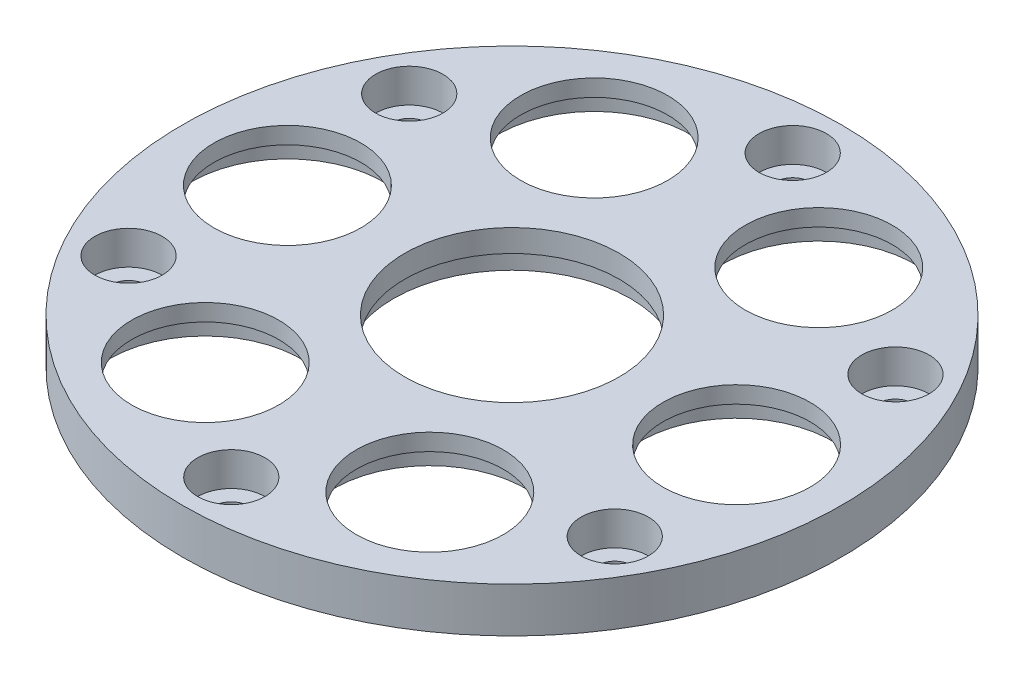
ISO-10303-21;
HEADER;
FILE_DESCRIPTION(('STEP AP214'),'2;1');
FILE_NAME('part.step','',(''),(''),'','','');
FILE_SCHEMA(('AUTOMOTIVE_DESIGN { 1 0 10303 214 1 1 1 1 }'));
ENDSEC;
DATA;
#1=APPLICATION_CONTEXT('core data for automotive mechanical design processes');
#2=APPLICATION_PROTOCOL_DEFINITION('international standard','automotive_design',2000,#1);
#3=PRODUCT_CONTEXT('',#1,'mechanical');
#4=PRODUCT('Part','Part','',(#3));
#5=PRODUCT_RELATED_PRODUCT_CATEGORY('part','',(#4));
#6=PRODUCT_DEFINITION_FORMATION('','',#4);
#7=PRODUCT_DEFINITION_CONTEXT('part definition',#1,'design');
#8=PRODUCT_DEFINITION('design','',#6,#7);
#9=PRODUCT_DEFINITION_SHAPE('','',#8);
#10=(LENGTH_UNIT() NAMED_UNIT(*) SI_UNIT(.MILLI.,.METRE.));
#11=(NAMED_UNIT(*) PLANE_ANGLE_UNIT() SI_UNIT($,.RADIAN.));
#12=(NAMED_UNIT(*) SI_UNIT($,.STERADIAN.) SOLID_ANGLE_UNIT());
#13=UNCERTAINTY_MEASURE_WITH_UNIT(LENGTH_MEASURE(1.E-05),#10,'distance_accuracy_value','');
#14=(GEOMETRIC_REPRESENTATION_CONTEXT(3) GLOBAL_UNCERTAINTY_ASSIGNED_CONTEXT((#13)) GLOBAL_UNIT_ASSIGNED_CONTEXT((#10,
#11,#12)) REPRESENTATION_CONTEXT('',''));
#15=CARTESIAN_POINT('',(0.,0.,0.));
#16=DIRECTION('',(0.,0.,1.));
#17=DIRECTION('',(1.,0.,0.));
#18=AXIS2_PLACEMENT_3D('',#15,#16,#17);
#19=CARTESIAN_POINT('',(21.650635094611,-4.,-12.4999999999999));
#20=DIRECTION('',(0.,1.,0.));
#21=DIRECTION('',(0.,0.,1.));
#22=AXIS2_PLACEMENT_3D('',#19,#20,#21);
#23=CYLINDRICAL_SURFACE('',#22,1.55);
#24=CARTESIAN_POINT('',(21.650635094611,-4.,-12.4999999999999));
#25=DIRECTION('',(0.,1.,0.));
#26=DIRECTION('',(0.,0.,1.));
#27=AXIS2_PLACEMENT_3D('',#24,#25,#26);
#28=CIRCLE('',#27,1.55);
#29=CARTESIAN_POINT('',(21.650635094611,-4.,-10.9499999999999));
#30=VERTEX_POINT('',#29);
#31=EDGE_CURVE('E80',#30,#30,#28,.T.);
#32=ORIENTED_EDGE('',*,*,#31,.F.);
#33=EDGE_LOOP('',(#32));
#34=FACE_BOUND('',#33,.T.);
#35=CARTESIAN_POINT('',(21.650635094611,-3.,-12.4999999999999));
#36=DIRECTION('',(0.,1.,0.));
#37=DIRECTION('',(0.,0.,1.));
#38=AXIS2_PLACEMENT_3D('',#35,#36,#37);
#39=CIRCLE('',#38,1.55);
#40=CARTESIAN_POINT('',(21.650635094611,-3.,-10.9499999999999));
#41=VERTEX_POINT('',#40);
#42=EDGE_CURVE('E219',#41,#41,#39,.T.);
#43=ORIENTED_EDGE('',*,*,#42,.T.);
#44=EDGE_LOOP('',(#43));
#45=FACE_BOUND('',#44,.T.);
#46=ADVANCED_FACE('F41',(#34,#45),#23,.F.);
#47=CARTESIAN_POINT('',(0.,-4.,-25.));
#48=DIRECTION('',(0.,1.,0.));
#49=DIRECTION('',(0.,0.,1.));
#50=AXIS2_PLACEMENT_3D('',#47,#48,#49);
#51=CYLINDRICAL_SURFACE('',#50,1.55);
#52=CARTESIAN_POINT('',(0.,-4.,-25.));
#53=DIRECTION('',(0.,1.,0.));
#54=DIRECTION('',(0.,0.,1.));
#55=AXIS2_PLACEMENT_3D('',#52,#53,#54);
#56=CIRCLE('',#55,1.55);
#57=CARTESIAN_POINT('',(0.,-4.,-23.45));
#58=VERTEX_POINT('',#57);
#59=EDGE_CURVE('E89',#58,#58,#56,.T.);
#60=ORIENTED_EDGE('',*,*,#59,.F.);
#61=EDGE_LOOP('',(#60));
#62=FACE_BOUND('',#61,.T.);
#63=CARTESIAN_POINT('',(0.,-3.,-25.));
#64=DIRECTION('',(0.,1.,0.));
#65=DIRECTION('',(0.,0.,1.));
#66=AXIS2_PLACEMENT_3D('',#63,#64,#65);
#67=CIRCLE('',#66,1.55);
#68=CARTESIAN_POINT('',(0.,-3.,-23.45));
#69=VERTEX_POINT('',#68);
#70=EDGE_CURVE('E230',#69,#69,#67,.T.);
#71=ORIENTED_EDGE('',*,*,#70,.T.);
#72=EDGE_LOOP('',(#71));
#73=FACE_BOUND('',#72,.T.);
#74=ADVANCED_FACE('F236',(#62,#73),#51,.F.);
#75=CARTESIAN_POINT('',(-21.6506350946108,-4.,-12.5000000000003));
#76=DIRECTION('',(0.,1.,0.));
#77=DIRECTION('',(0.,0.,1.));
#78=AXIS2_PLACEMENT_3D('',#75,#76,#77);
#79=CYLINDRICAL_SURFACE('',#78,1.55);
#80=CARTESIAN_POINT('',(-21.6506350946108,-4.,-12.5000000000003));
#81=DIRECTION('',(0.,1.,0.));
#82=DIRECTION('',(0.,0.,1.));
#83=AXIS2_PLACEMENT_3D('',#80,#81,#82);
#84=CIRCLE('',#83,1.55);
#85=CARTESIAN_POINT('',(-21.6506350946108,-4.,-10.9500000000003));
#86=VERTEX_POINT('',#85);
#87=EDGE_CURVE('E92',#86,#86,#84,.T.);
#88=ORIENTED_EDGE('',*,*,#87,.F.);
#89=EDGE_LOOP('',(#88));
#90=FACE_BOUND('',#89,.T.);
#91=CARTESIAN_POINT('',(-21.6506350946108,-3.,-12.5000000000003));
#92=DIRECTION('',(0.,1.,0.));
#93=DIRECTION('',(0.,0.,1.));
#94=AXIS2_PLACEMENT_3D('',#91,#92,#93);
#95=CIRCLE('',#94,1.55);
#96=CARTESIAN_POINT('',(-21.6506350946108,-3.,-10.9500000000003));
#97=VERTEX_POINT('',#96);
#98=EDGE_CURVE('E179',#97,#97,#95,.T.);
#99=ORIENTED_EDGE('',*,*,#98,.T.);
#100=EDGE_LOOP('',(#99));
#101=FACE_BOUND('',#100,.T.);
#102=ADVANCED_FACE('F295',(#90,#101),#79,.F.);
#103=CARTESIAN_POINT('',(-21.6506350946111,-4.,12.4999999999998));
#104=DIRECTION('',(0.,1.,0.));
#105=DIRECTION('',(0.,0.,1.));
#106=AXIS2_PLACEMENT_3D('',#103,#104,#105);
#107=CYLINDRICAL_SURFACE('',#106,1.55);
#108=CARTESIAN_POINT('',(-21.6506350946111,-4.,12.4999999999998));
#109=DIRECTION('',(0.,1.,0.));
#110=DIRECTION('',(0.,0.,1.));
#111=AXIS2_PLACEMENT_3D('',#108,#109,#110);
#112=CIRCLE('',#111,1.55);
#113=CARTESIAN_POINT('',(-21.6506350946111,-4.,14.0499999999998));
#114=VERTEX_POINT('',#113);
#115=EDGE_CURVE('E83',#114,#114,#112,.T.);
#116=ORIENTED_EDGE('',*,*,#115,.F.);
#117=EDGE_LOOP('',(#116));
#118=FACE_BOUND('',#117,.T.);
#119=CARTESIAN_POINT('',(-21.6506350946111,-3.,12.4999999999998));
#120=DIRECTION('',(0.,1.,0.));
#121=DIRECTION('',(0.,0.,1.));
#122=AXIS2_PLACEMENT_3D('',#119,#120,#121);
#123=CIRCLE('',#122,1.55);
#124=CARTESIAN_POINT('',(-21.6506350946111,-3.,14.0499999999998));
#125=VERTEX_POINT('',#124);
#126=EDGE_CURVE('E189',#125,#125,#123,.T.);
#127=ORIENTED_EDGE('',*,*,#126,.T.);
#128=EDGE_LOOP('',(#127));
#129=FACE_BOUND('',#128,.T.);
#130=ADVANCED_FACE('F310',(#118,#129),#107,.F.);
#131=CARTESIAN_POINT('',(-1.9677852743466E-13,-4.,25.));
#132=DIRECTION('',(0.,1.,0.));
#133=DIRECTION('',(0.,0.,1.));
#134=AXIS2_PLACEMENT_3D('',#131,#132,#133);
#135=CYLINDRICAL_SURFACE('',#134,1.55);
#136=CARTESIAN_POINT('',(-1.9677852743466E-13,-4.,25.));
#137=DIRECTION('',(0.,1.,0.));
#138=DIRECTION('',(0.,0.,1.));
#139=AXIS2_PLACEMENT_3D('',#136,#137,#138);
#140=CIRCLE('',#139,1.55);
#141=CARTESIAN_POINT('',(-1.9677852743466E-13,-4.,26.55));
#142=VERTEX_POINT('',#141);
#143=EDGE_CURVE('E79',#142,#142,#140,.T.);
#144=ORIENTED_EDGE('',*,*,#143,.F.);
#145=EDGE_LOOP('',(#144));
#146=FACE_BOUND('',#145,.T.);
#147=CARTESIAN_POINT('',(-1.9677852743466E-13,-3.,25.));
#148=DIRECTION('',(0.,1.,0.));
#149=DIRECTION('',(0.,0.,1.));
#150=AXIS2_PLACEMENT_3D('',#147,#148,#149);
#151=CIRCLE('',#150,1.55);
#152=CARTESIAN_POINT('',(-1.9677852743466E-13,-3.,26.55));
#153=VERTEX_POINT('',#152);
#154=EDGE_CURVE('E200',#153,#153,#151,.T.);
#155=ORIENTED_EDGE('',*,*,#154,.T.);
#156=EDGE_LOOP('',(#155));
#157=FACE_BOUND('',#156,.T.);
#158=ADVANCED_FACE('F285',(#146,#157),#135,.F.);
#159=CARTESIAN_POINT('',(21.6506350946109,-4.,12.5000000000001));
#160=DIRECTION('',(0.,1.,0.));
#161=DIRECTION('',(0.,0.,1.));
#162=AXIS2_PLACEMENT_3D('',#159,#160,#161);
#163=CYLINDRICAL_SURFACE('',#162,1.55);
#164=CARTESIAN_POINT('',(21.6506350946109,-4.,12.5000000000001));
#165=DIRECTION('',(0.,1.,0.));
#166=DIRECTION('',(0.,0.,1.));
#167=AXIS2_PLACEMENT_3D('',#164,#165,#166);
#168=CIRCLE('',#167,1.55);
#169=CARTESIAN_POINT('',(21.6506350946109,-4.,14.0500000000001));
#170=VERTEX_POINT('',#169);
#171=EDGE_CURVE('E76',#170,#170,#168,.T.);
#172=ORIENTED_EDGE('',*,*,#171,.F.);
#173=EDGE_LOOP('',(#172));
#174=FACE_BOUND('',#173,.T.);
#175=CARTESIAN_POINT('',(21.6506350946109,-3.,12.5000000000001));
#176=DIRECTION('',(0.,1.,0.));
#177=DIRECTION('',(0.,0.,1.));
#178=AXIS2_PLACEMENT_3D('',#175,#176,#177);
#179=CIRCLE('',#178,1.55);
#180=CARTESIAN_POINT('',(21.6506350946109,-3.,14.0500000000001));
#181=VERTEX_POINT('',#180);
#182=EDGE_CURVE('E209',#181,#181,#179,.T.);
#183=ORIENTED_EDGE('',*,*,#182,.T.);
#184=EDGE_LOOP('',(#183));
#185=FACE_BOUND('',#184,.T.);
#186=ADVANCED_FACE('F277',(#174,#185),#163,.F.);
#187=CARTESIAN_POINT('',(0.,-4.,0.));
#188=DIRECTION('',(0.,1.,0.));
#189=DIRECTION('',(0.,0.,1.));
#190=AXIS2_PLACEMENT_3D('',#187,#188,#189);
#191=CYLINDRICAL_SURFACE('',#190,29.35);
#192=CARTESIAN_POINT('',(0.,-4.,0.));
#193=DIRECTION('',(0.,1.,0.));
#194=DIRECTION('',(0.,0.,1.));
#195=AXIS2_PLACEMENT_3D('',#192,#193,#194);
#196=CIRCLE('',#195,29.35);
#197=CARTESIAN_POINT('',(0.,-4.,29.35));
#198=VERTEX_POINT('',#197);
#199=EDGE_CURVE('E10',#198,#198,#196,.T.);
#200=ORIENTED_EDGE('',*,*,#199,.T.);
#201=EDGE_LOOP('',(#200));
#202=FACE_BOUND('',#201,.T.);
#203=CARTESIAN_POINT('',(0.,0.,0.));
#204=DIRECTION('',(0.,1.,0.));
#205=DIRECTION('',(0.,0.,1.));
#206=AXIS2_PLACEMENT_3D('',#203,#204,#205);
#207=CIRCLE('',#206,29.35);
#208=CARTESIAN_POINT('',(0.,0.,29.35));
#209=VERTEX_POINT('',#208);
#210=EDGE_CURVE('E45',#209,#209,#207,.T.);
#211=ORIENTED_EDGE('',*,*,#210,.F.);
#212=EDGE_LOOP('',(#211));
#213=FACE_BOUND('',#212,.T.);
#214=ADVANCED_FACE('F43',(#202,#213),#191,.T.);
#215=CARTESIAN_POINT('',(0.,-4.,0.));
#216=DIRECTION('',(0.,1.,0.));
#217=DIRECTION('',(0.,0.,1.));
#218=AXIS2_PLACEMENT_3D('',#215,#216,#217);
#219=PLANE('',#218);
#220=CARTESIAN_POINT('',(0.,-4.,0.));
#221=DIRECTION('',(0.,1.,0.));
#222=DIRECTION('',(0.,0.,1.));
#223=AXIS2_PLACEMENT_3D('',#220,#221,#222);
#224=CIRCLE('',#223,10.55);
#225=CARTESIAN_POINT('',(0.,-4.,10.55));
#226=VERTEX_POINT('',#225);
#227=EDGE_CURVE('E163',#226,#226,#224,.T.);
#228=ORIENTED_EDGE('',*,*,#227,.T.);
#229=EDGE_LOOP('',(#228));
#230=FACE_BOUND('',#229,.T.);
#231=CARTESIAN_POINT('',(-9.99999999999996,-4.,-17.3205080756888));
#232=DIRECTION('',(0.,1.,0.));
#233=DIRECTION('',(0.,0.,1.));
#234=AXIS2_PLACEMENT_3D('',#231,#232,#233);
#235=CIRCLE('',#234,8.55);
#236=CARTESIAN_POINT('',(-9.99999999999996,-4.,-8.7705080756888));
#237=VERTEX_POINT('',#236);
#238=EDGE_CURVE('E110',#237,#237,#235,.T.);
#239=ORIENTED_EDGE('',*,*,#238,.T.);
#240=EDGE_LOOP('',(#239));
#241=FACE_BOUND('',#240,.T.);
#242=CARTESIAN_POINT('',(10.0000000000001,-4.,-17.3205080756887));
#243=DIRECTION('',(0.,1.,0.));
#244=DIRECTION('',(0.,0.,1.));
#245=AXIS2_PLACEMENT_3D('',#242,#243,#244);
#246=CIRCLE('',#245,8.55);
#247=CARTESIAN_POINT('',(10.0000000000001,-4.,-8.77050807568873));
#248=VERTEX_POINT('',#247);
#249=EDGE_CURVE('E141',#248,#248,#246,.T.);
#250=ORIENTED_EDGE('',*,*,#249,.T.);
#251=EDGE_LOOP('',(#250));
#252=FACE_BOUND('',#251,.T.);
#253=CARTESIAN_POINT('',(20.,-4.,1.37209959955431E-13));
#254=DIRECTION('',(0.,1.,0.));
#255=DIRECTION('',(0.,0.,1.));
#256=AXIS2_PLACEMENT_3D('',#253,#254,#255);
#257=CIRCLE('',#256,8.55);
#258=CARTESIAN_POINT('',(20.,-4.,8.55000000000013));
#259=VERTEX_POINT('',#258);
#260=EDGE_CURVE('E129',#259,#259,#257,.T.);
#261=ORIENTED_EDGE('',*,*,#260,.T.);
#262=EDGE_LOOP('',(#261));
#263=FACE_BOUND('',#262,.T.);
#264=CARTESIAN_POINT('',(9.99999999999984,-4.,17.3205080756889));
#265=DIRECTION('',(0.,1.,0.));
#266=DIRECTION('',(0.,0.,1.));
#267=AXIS2_PLACEMENT_3D('',#264,#265,#266);
#268=CIRCLE('',#267,8.55);
#269=CARTESIAN_POINT('',(9.99999999999984,-4.,25.8705080756889));
#270=VERTEX_POINT('',#269);
#271=EDGE_CURVE('E117',#270,#270,#268,.T.);
#272=ORIENTED_EDGE('',*,*,#271,.T.);
#273=EDGE_LOOP('',(#272));
#274=FACE_BOUND('',#273,.T.);
#275=CARTESIAN_POINT('',(-10.0000000000002,-4.,17.3205080756887));
#276=DIRECTION('',(0.,1.,0.));
#277=DIRECTION('',(0.,0.,1.));
#278=AXIS2_PLACEMENT_3D('',#275,#276,#277);
#279=CIRCLE('',#278,8.55);
#280=CARTESIAN_POINT('',(-10.0000000000002,-4.,25.8705080756887));
#281=VERTEX_POINT('',#280);
#282=EDGE_CURVE('E121',#281,#281,#279,.T.);
#283=ORIENTED_EDGE('',*,*,#282,.T.);
#284=EDGE_LOOP('',(#283));
#285=FACE_BOUND('',#284,.T.);
#286=CARTESIAN_POINT('',(-20.,-4.,0.));
#287=DIRECTION('',(0.,1.,0.));
#288=DIRECTION('',(0.,0.,1.));
#289=AXIS2_PLACEMENT_3D('',#286,#287,#288);
#290=CIRCLE('',#289,8.55);
#291=CARTESIAN_POINT('',(-20.,-4.,8.55));
#292=VERTEX_POINT('',#291);
#293=EDGE_CURVE('E99',#292,#292,#290,.T.);
#294=ORIENTED_EDGE('',*,*,#293,.T.);
#295=EDGE_LOOP('',(#294));
#296=FACE_BOUND('',#295,.T.);
#297=ORIENTED_EDGE('',*,*,#171,.T.);
#298=EDGE_LOOP('',(#297));
#299=FACE_BOUND('',#298,.T.);
#300=ORIENTED_EDGE('',*,*,#143,.T.);
#301=EDGE_LOOP('',(#300));
#302=FACE_BOUND('',#301,.T.);
#303=ORIENTED_EDGE('',*,*,#115,.T.);
#304=EDGE_LOOP('',(#303));
#305=FACE_BOUND('',#304,.T.);
#306=ORIENTED_EDGE('',*,*,#87,.T.);
#307=EDGE_LOOP('',(#306));
#308=FACE_BOUND('',#307,.T.);
#309=ORIENTED_EDGE('',*,*,#59,.T.);
#310=EDGE_LOOP('',(#309));
#311=FACE_BOUND('',#310,.T.);
#312=ORIENTED_EDGE('',*,*,#31,.T.);
#313=EDGE_LOOP('',(#312));
#314=FACE_BOUND('',#313,.T.);
#315=ORIENTED_EDGE('',*,*,#199,.F.);
#316=EDGE_LOOP('',(#315));
#317=FACE_BOUND('',#316,.T.);
#318=ADVANCED_FACE('F256',(#230,#241,#252,#263,#274,#285,#296,#299,#302,#305,#308,#311,#314,
#317),#219,.F.);
#319=CARTESIAN_POINT('',(0.,0.,0.));
#320=DIRECTION('',(0.,1.,0.));
#321=DIRECTION('',(0.,0.,1.));
#322=AXIS2_PLACEMENT_3D('',#319,#320,#321);
#323=PLANE('',#322);
#324=CARTESIAN_POINT('',(-21.6506350946111,0.,12.4999999999998));
#325=DIRECTION('',(0.,1.,0.));
#326=DIRECTION('',(0.,0.,1.));
#327=AXIS2_PLACEMENT_3D('',#324,#325,#326);
#328=CIRCLE('',#327,3.);
#329=CARTESIAN_POINT('',(-21.6506350946111,0.,15.4999999999998));
#330=VERTEX_POINT('',#329);
#331=EDGE_CURVE('E185',#330,#330,#328,.T.);
#332=ORIENTED_EDGE('',*,*,#331,.F.);
#333=EDGE_LOOP('',(#332));
#334=FACE_BOUND('',#333,.T.);
#335=CARTESIAN_POINT('',(-1.9677852743466E-13,0.,25.));
#336=DIRECTION('',(0.,1.,0.));
#337=DIRECTION('',(0.,0.,1.));
#338=AXIS2_PLACEMENT_3D('',#335,#336,#337);
#339=CIRCLE('',#338,3.);
#340=CARTESIAN_POINT('',(-1.9677852743466E-13,0.,28.));
#341=VERTEX_POINT('',#340);
#342=EDGE_CURVE('E194',#341,#341,#339,.T.);
#343=ORIENTED_EDGE('',*,*,#342,.F.);
#344=EDGE_LOOP('',(#343));
#345=FACE_BOUND('',#344,.T.);
#346=CARTESIAN_POINT('',(21.6506350946109,0.,12.5000000000001));
#347=DIRECTION('',(0.,1.,0.));
#348=DIRECTION('',(0.,0.,1.));
#349=AXIS2_PLACEMENT_3D('',#346,#347,#348);
#350=CIRCLE('',#349,3.);
#351=CARTESIAN_POINT('',(21.6506350946109,0.,15.5000000000001));
#352=VERTEX_POINT('',#351);
#353=EDGE_CURVE('E204',#352,#352,#350,.T.);
#354=ORIENTED_EDGE('',*,*,#353,.F.);
#355=EDGE_LOOP('',(#354));
#356=FACE_BOUND('',#355,.T.);
#357=CARTESIAN_POINT('',(21.650635094611,0.,-12.4999999999999));
#358=DIRECTION('',(0.,1.,0.));
#359=DIRECTION('',(0.,0.,1.));
#360=AXIS2_PLACEMENT_3D('',#357,#358,#359);
#361=CIRCLE('',#360,3.);
#362=CARTESIAN_POINT('',(21.650635094611,0.,-9.49999999999994));
#363=VERTEX_POINT('',#362);
#364=EDGE_CURVE('E213',#363,#363,#361,.T.);
#365=ORIENTED_EDGE('',*,*,#364,.F.);
#366=EDGE_LOOP('',(#365));
#367=FACE_BOUND('',#366,.T.);
#368=CARTESIAN_POINT('',(0.,0.,-25.));
#369=DIRECTION('',(0.,1.,0.));
#370=DIRECTION('',(0.,0.,1.));
#371=AXIS2_PLACEMENT_3D('',#368,#369,#370);
#372=CIRCLE('',#371,3.);
#373=CARTESIAN_POINT('',(0.,0.,-22.));
#374=VERTEX_POINT('',#373);
#375=EDGE_CURVE('E224',#374,#374,#372,.T.);
#376=ORIENTED_EDGE('',*,*,#375,.F.);
#377=EDGE_LOOP('',(#376));
#378=FACE_BOUND('',#377,.T.);
#379=CARTESIAN_POINT('',(-21.6506350946108,0.,-12.5000000000003));
#380=DIRECTION('',(0.,1.,0.));
#381=DIRECTION('',(0.,0.,1.));
#382=AXIS2_PLACEMENT_3D('',#379,#380,#381);
#383=CIRCLE('',#382,3.);
#384=CARTESIAN_POINT('',(-21.6506350946108,0.,-9.50000000000028));
#385=VERTEX_POINT('',#384);
#386=EDGE_CURVE('E176',#385,#385,#383,.T.);
#387=ORIENTED_EDGE('',*,*,#386,.F.);
#388=EDGE_LOOP('',(#387));
#389=FACE_BOUND('',#388,.T.);
#390=CARTESIAN_POINT('',(-9.99999999999996,0.,-17.3205080756888));
#391=DIRECTION('',(0.,1.,0.));
#392=DIRECTION('',(0.,0.,1.));
#393=AXIS2_PLACEMENT_3D('',#390,#391,#392);
#394=CIRCLE('',#393,6.55);
#395=CARTESIAN_POINT('',(-9.99999999999996,0.,-10.7705080756888));
#396=VERTEX_POINT('',#395);
#397=EDGE_CURVE('E66',#396,#396,#394,.T.);
#398=ORIENTED_EDGE('',*,*,#397,.F.);
#399=EDGE_LOOP('',(#398));
#400=FACE_BOUND('',#399,.T.);
#401=CARTESIAN_POINT('',(10.0000000000001,0.,-17.3205080756887));
#402=DIRECTION('',(0.,1.,0.));
#403=DIRECTION('',(0.,0.,1.));
#404=AXIS2_PLACEMENT_3D('',#401,#402,#403);
#405=CIRCLE('',#404,6.55);
#406=CARTESIAN_POINT('',(10.0000000000001,0.,-10.7705080756887));
#407=VERTEX_POINT('',#406);
#408=EDGE_CURVE('E61',#407,#407,#405,.T.);
#409=ORIENTED_EDGE('',*,*,#408,.F.);
#410=EDGE_LOOP('',(#409));
#411=FACE_BOUND('',#410,.T.);
#412=CARTESIAN_POINT('',(20.,0.,1.37209959955431E-13));
#413=DIRECTION('',(0.,1.,0.));
#414=DIRECTION('',(0.,0.,1.));
#415=AXIS2_PLACEMENT_3D('',#412,#413,#414);
#416=CIRCLE('',#415,6.55);
#417=CARTESIAN_POINT('',(20.,0.,6.55000000000014));
#418=VERTEX_POINT('',#417);
#419=EDGE_CURVE('E65',#418,#418,#416,.T.);
#420=ORIENTED_EDGE('',*,*,#419,.F.);
#421=EDGE_LOOP('',(#420));
#422=FACE_BOUND('',#421,.T.);
#423=CARTESIAN_POINT('',(9.99999999999984,0.,17.3205080756889));
#424=DIRECTION('',(0.,1.,0.));
#425=DIRECTION('',(0.,0.,1.));
#426=AXIS2_PLACEMENT_3D('',#423,#424,#425);
#427=CIRCLE('',#426,6.55);
#428=CARTESIAN_POINT('',(9.99999999999984,0.,23.8705080756889));
#429=VERTEX_POINT('',#428);
#430=EDGE_CURVE('E70',#429,#429,#427,.T.);
#431=ORIENTED_EDGE('',*,*,#430,.F.);
#432=EDGE_LOOP('',(#431));
#433=FACE_BOUND('',#432,.T.);
#434=CARTESIAN_POINT('',(-10.0000000000002,0.,17.3205080756887));
#435=DIRECTION('',(0.,1.,0.));
#436=DIRECTION('',(0.,0.,1.));
#437=AXIS2_PLACEMENT_3D('',#434,#435,#436);
#438=CIRCLE('',#437,6.55);
#439=CARTESIAN_POINT('',(-10.0000000000002,0.,23.8705080756887));
#440=VERTEX_POINT('',#439);
#441=EDGE_CURVE('E60',#440,#440,#438,.T.);
#442=ORIENTED_EDGE('',*,*,#441,.F.);
#443=EDGE_LOOP('',(#442));
#444=FACE_BOUND('',#443,.T.);
#445=CARTESIAN_POINT('',(0.,0.,0.));
#446=DIRECTION('',(0.,1.,0.));
#447=DIRECTION('',(0.,0.,1.));
#448=AXIS2_PLACEMENT_3D('',#445,#446,#447);
#449=CIRCLE('',#448,9.55);
#450=CARTESIAN_POINT('',(0.,0.,9.55));
#451=VERTEX_POINT('',#450);
#452=EDGE_CURVE('E96',#451,#451,#449,.T.);
#453=ORIENTED_EDGE('',*,*,#452,.F.);
#454=EDGE_LOOP('',(#453));
#455=FACE_BOUND('',#454,.T.);
#456=CARTESIAN_POINT('',(-20.,0.,0.));
#457=DIRECTION('',(0.,1.,0.));
#458=DIRECTION('',(0.,0.,1.));
#459=AXIS2_PLACEMENT_3D('',#456,#457,#458);
#460=CIRCLE('',#459,6.55);
#461=CARTESIAN_POINT('',(-20.,0.,6.55));
#462=VERTEX_POINT('',#461);
#463=EDGE_CURVE('E55',#462,#462,#460,.T.);
#464=ORIENTED_EDGE('',*,*,#463,.F.);
#465=EDGE_LOOP('',(#464));
#466=FACE_BOUND('',#465,.T.);
#467=ORIENTED_EDGE('',*,*,#210,.T.);
#468=EDGE_LOOP('',(#467));
#469=FACE_BOUND('',#468,.T.);
#470=ADVANCED_FACE('F252',(#334,#345,#356,#367,#378,#389,#400,#411,#422,#433,#444,#455,#466,
#469),#323,.T.);
#471=CARTESIAN_POINT('',(-20.,-4.,0.));
#472=DIRECTION('',(0.,1.,0.));
#473=DIRECTION('',(0.,0.,1.));
#474=AXIS2_PLACEMENT_3D('',#471,#472,#473);
#475=CYLINDRICAL_SURFACE('',#474,6.55);
#476=CARTESIAN_POINT('',(-20.,-1.5,0.));
#477=DIRECTION('',(0.,1.,0.));
#478=DIRECTION('',(0.,0.,1.));
#479=AXIS2_PLACEMENT_3D('',#476,#477,#478);
#480=CIRCLE('',#479,6.55);
#481=CARTESIAN_POINT('',(-20.,-1.5,6.55));
#482=VERTEX_POINT('',#481);
#483=EDGE_CURVE('E106',#482,#482,#480,.T.);
#484=ORIENTED_EDGE('',*,*,#483,.F.);
#485=EDGE_LOOP('',(#484));
#486=FACE_BOUND('',#485,.T.);
#487=ORIENTED_EDGE('',*,*,#463,.T.);
#488=EDGE_LOOP('',(#487));
#489=FACE_BOUND('',#488,.T.);
#490=ADVANCED_FACE('F255',(#486,#489),#475,.F.);
#491=CARTESIAN_POINT('',(0.,-4.,0.));
#492=DIRECTION('',(0.,1.,0.));
#493=DIRECTION('',(0.,0.,1.));
#494=AXIS2_PLACEMENT_3D('',#491,#492,#493);
#495=CYLINDRICAL_SURFACE('',#494,9.55);
#496=CARTESIAN_POINT('',(0.,-2.,0.));
#497=DIRECTION('',(0.,1.,0.));
#498=DIRECTION('',(0.,0.,1.));
#499=AXIS2_PLACEMENT_3D('',#496,#497,#498);
#500=CIRCLE('',#499,9.55);
#501=CARTESIAN_POINT('',(0.,-2.,9.55));
#502=VERTEX_POINT('',#501);
#503=EDGE_CURVE('E170',#502,#502,#500,.T.);
#504=ORIENTED_EDGE('',*,*,#503,.F.);
#505=EDGE_LOOP('',(#504));
#506=FACE_BOUND('',#505,.T.);
#507=ORIENTED_EDGE('',*,*,#452,.T.);
#508=EDGE_LOOP('',(#507));
#509=FACE_BOUND('',#508,.T.);
#510=ADVANCED_FACE('F301',(#506,#509),#495,.F.);
#511=CARTESIAN_POINT('',(-10.0000000000002,-4.,17.3205080756887));
#512=DIRECTION('',(0.,1.,0.));
#513=DIRECTION('',(0.,0.,1.));
#514=AXIS2_PLACEMENT_3D('',#511,#512,#513);
#515=CYLINDRICAL_SURFACE('',#514,6.55);
#516=CARTESIAN_POINT('',(-10.0000000000002,-1.5,17.3205080756887));
#517=DIRECTION('',(0.,1.,0.));
#518=DIRECTION('',(0.,0.,1.));
#519=AXIS2_PLACEMENT_3D('',#516,#517,#518);
#520=CIRCLE('',#519,6.55);
#521=CARTESIAN_POINT('',(-10.0000000000002,-1.5,23.8705080756887));
#522=VERTEX_POINT('',#521);
#523=EDGE_CURVE('E159',#522,#522,#520,.T.);
#524=ORIENTED_EDGE('',*,*,#523,.F.);
#525=EDGE_LOOP('',(#524));
#526=FACE_BOUND('',#525,.T.);
#527=ORIENTED_EDGE('',*,*,#441,.T.);
#528=EDGE_LOOP('',(#527));
#529=FACE_BOUND('',#528,.T.);
#530=ADVANCED_FACE('F317',(#526,#529),#515,.F.);
#531=CARTESIAN_POINT('',(9.99999999999984,-4.,17.3205080756889));
#532=DIRECTION('',(0.,1.,0.));
#533=DIRECTION('',(0.,0.,1.));
#534=AXIS2_PLACEMENT_3D('',#531,#532,#533);
#535=CYLINDRICAL_SURFACE('',#534,6.55);
#536=CARTESIAN_POINT('',(9.99999999999984,-1.5,17.3205080756889));
#537=DIRECTION('',(0.,1.,0.));
#538=DIRECTION('',(0.,0.,1.));
#539=AXIS2_PLACEMENT_3D('',#536,#537,#538);
#540=CIRCLE('',#539,6.55);
#541=CARTESIAN_POINT('',(9.99999999999984,-1.5,23.8705080756889));
#542=VERTEX_POINT('',#541);
#543=EDGE_CURVE('E118',#542,#542,#540,.T.);
#544=ORIENTED_EDGE('',*,*,#543,.F.);
#545=EDGE_LOOP('',(#544));
#546=FACE_BOUND('',#545,.T.);
#547=ORIENTED_EDGE('',*,*,#430,.T.);
#548=EDGE_LOOP('',(#547));
#549=FACE_BOUND('',#548,.T.);
#550=ADVANCED_FACE('F320',(#546,#549),#535,.F.);
#551=CARTESIAN_POINT('',(20.,-4.,1.37209959955431E-13));
#552=DIRECTION('',(0.,1.,0.));
#553=DIRECTION('',(0.,0.,1.));
#554=AXIS2_PLACEMENT_3D('',#551,#552,#553);
#555=CYLINDRICAL_SURFACE('',#554,6.55);
#556=CARTESIAN_POINT('',(20.,-1.5,1.37209959955431E-13));
#557=DIRECTION('',(0.,1.,0.));
#558=DIRECTION('',(0.,0.,1.));
#559=AXIS2_PLACEMENT_3D('',#556,#557,#558);
#560=CIRCLE('',#559,6.55);
#561=CARTESIAN_POINT('',(20.,-1.5,6.55000000000014));
#562=VERTEX_POINT('',#561);
#563=EDGE_CURVE('E124',#562,#562,#560,.T.);
#564=ORIENTED_EDGE('',*,*,#563,.F.);
#565=EDGE_LOOP('',(#564));
#566=FACE_BOUND('',#565,.T.);
#567=ORIENTED_EDGE('',*,*,#419,.T.);
#568=EDGE_LOOP('',(#567));
#569=FACE_BOUND('',#568,.T.);
#570=ADVANCED_FACE('F324',(#566,#569),#555,.F.);
#571=CARTESIAN_POINT('',(10.0000000000001,-4.,-17.3205080756887));
#572=DIRECTION('',(0.,1.,0.));
#573=DIRECTION('',(0.,0.,1.));
#574=AXIS2_PLACEMENT_3D('',#571,#572,#573);
#575=CYLINDRICAL_SURFACE('',#574,6.55);
#576=CARTESIAN_POINT('',(10.0000000000001,-1.5,-17.3205080756887));
#577=DIRECTION('',(0.,1.,0.));
#578=DIRECTION('',(0.,0.,1.));
#579=AXIS2_PLACEMENT_3D('',#576,#577,#578);
#580=CIRCLE('',#579,6.55);
#581=CARTESIAN_POINT('',(10.0000000000001,-1.5,-10.7705080756887));
#582=VERTEX_POINT('',#581);
#583=EDGE_CURVE('E136',#582,#582,#580,.T.);
#584=ORIENTED_EDGE('',*,*,#583,.F.);
#585=EDGE_LOOP('',(#584));
#586=FACE_BOUND('',#585,.T.);
#587=ORIENTED_EDGE('',*,*,#408,.T.);
#588=EDGE_LOOP('',(#587));
#589=FACE_BOUND('',#588,.T.);
#590=ADVANCED_FACE('F308',(#586,#589),#575,.F.);
#591=CARTESIAN_POINT('',(-9.99999999999996,-4.,-17.3205080756888));
#592=DIRECTION('',(0.,1.,0.));
#593=DIRECTION('',(0.,0.,1.));
#594=AXIS2_PLACEMENT_3D('',#591,#592,#593);
#595=CYLINDRICAL_SURFACE('',#594,6.55);
#596=CARTESIAN_POINT('',(-9.99999999999996,-1.5,-17.3205080756888));
#597=DIRECTION('',(0.,1.,0.));
#598=DIRECTION('',(0.,0.,1.));
#599=AXIS2_PLACEMENT_3D('',#596,#597,#598);
#600=CIRCLE('',#599,6.55);
#601=CARTESIAN_POINT('',(-9.99999999999996,-1.5,-10.7705080756888));
#602=VERTEX_POINT('',#601);
#603=EDGE_CURVE('E147',#602,#602,#600,.T.);
#604=ORIENTED_EDGE('',*,*,#603,.F.);
#605=EDGE_LOOP('',(#604));
#606=FACE_BOUND('',#605,.T.);
#607=ORIENTED_EDGE('',*,*,#397,.T.);
#608=EDGE_LOOP('',(#607));
#609=FACE_BOUND('',#608,.T.);
#610=ADVANCED_FACE('F304',(#606,#609),#595,.F.);
#611=CARTESIAN_POINT('',(-9.99999999999996,-4.,-17.3205080756888));
#612=DIRECTION('',(0.,1.,0.));
#613=DIRECTION('',(0.,0.,1.));
#614=AXIS2_PLACEMENT_3D('',#611,#612,#613);
#615=CYLINDRICAL_SURFACE('',#614,8.55);
#616=ORIENTED_EDGE('',*,*,#238,.F.);
#617=EDGE_LOOP('',(#616));
#618=FACE_BOUND('',#617,.T.);
#619=CARTESIAN_POINT('',(-9.99999999999996,-1.5,-17.3205080756888));
#620=DIRECTION('',(0.,1.,0.));
#621=DIRECTION('',(0.,0.,1.));
#622=AXIS2_PLACEMENT_3D('',#619,#620,#621);
#623=CIRCLE('',#622,8.55);
#624=CARTESIAN_POINT('',(-9.99999999999996,-1.5,-8.7705080756888));
#625=VERTEX_POINT('',#624);
#626=EDGE_CURVE('E148',#625,#625,#623,.T.);
#627=ORIENTED_EDGE('',*,*,#626,.T.);
#628=EDGE_LOOP('',(#627));
#629=FACE_BOUND('',#628,.T.);
#630=ADVANCED_FACE('F307',(#618,#629),#615,.F.);
#631=CARTESIAN_POINT('',(0.,-1.5,0.));
#632=DIRECTION('',(0.,1.,0.));
#633=DIRECTION('',(0.,0.,1.));
#634=AXIS2_PLACEMENT_3D('',#631,#632,#633);
#635=PLANE('',#634);
#636=ORIENTED_EDGE('',*,*,#603,.T.);
#637=EDGE_LOOP('',(#636));
#638=FACE_BOUND('',#637,.T.);
#639=ORIENTED_EDGE('',*,*,#626,.F.);
#640=EDGE_LOOP('',(#639));
#641=FACE_BOUND('',#640,.T.);
#642=ADVANCED_FACE('F398',(#638,#641),#635,.F.);
#643=CARTESIAN_POINT('',(10.0000000000001,-4.,-17.3205080756887));
#644=DIRECTION('',(0.,1.,0.));
#645=DIRECTION('',(0.,0.,1.));
#646=AXIS2_PLACEMENT_3D('',#643,#644,#645);
#647=CYLINDRICAL_SURFACE('',#646,8.55);
#648=ORIENTED_EDGE('',*,*,#249,.F.);
#649=EDGE_LOOP('',(#648));
#650=FACE_BOUND('',#649,.T.);
#651=CARTESIAN_POINT('',(10.0000000000001,-1.5,-17.3205080756887));
#652=DIRECTION('',(0.,1.,0.));
#653=DIRECTION('',(0.,0.,1.));
#654=AXIS2_PLACEMENT_3D('',#651,#652,#653);
#655=CIRCLE('',#654,8.55);
#656=CARTESIAN_POINT('',(10.0000000000001,-1.5,-8.77050807568873));
#657=VERTEX_POINT('',#656);
#658=EDGE_CURVE('E137',#657,#657,#655,.T.);
#659=ORIENTED_EDGE('',*,*,#658,.T.);
#660=EDGE_LOOP('',(#659));
#661=FACE_BOUND('',#660,.T.);
#662=ADVANCED_FACE('F401',(#650,#661),#647,.F.);
#663=CARTESIAN_POINT('',(0.,-1.5,0.));
#664=DIRECTION('',(0.,1.,0.));
#665=DIRECTION('',(0.,0.,1.));
#666=AXIS2_PLACEMENT_3D('',#663,#664,#665);
#667=PLANE('',#666);
#668=ORIENTED_EDGE('',*,*,#583,.T.);
#669=EDGE_LOOP('',(#668));
#670=FACE_BOUND('',#669,.T.);
#671=ORIENTED_EDGE('',*,*,#658,.F.);
#672=EDGE_LOOP('',(#671));
#673=FACE_BOUND('',#672,.T.);
#674=ADVANCED_FACE('F406',(#670,#673),#667,.F.);
#675=CARTESIAN_POINT('',(20.,-4.,1.37209959955431E-13));
#676=DIRECTION('',(0.,1.,0.));
#677=DIRECTION('',(0.,0.,1.));
#678=AXIS2_PLACEMENT_3D('',#675,#676,#677);
#679=CYLINDRICAL_SURFACE('',#678,8.55);
#680=ORIENTED_EDGE('',*,*,#260,.F.);
#681=EDGE_LOOP('',(#680));
#682=FACE_BOUND('',#681,.T.);
#683=CARTESIAN_POINT('',(20.,-1.5,1.37209959955431E-13));
#684=DIRECTION('',(0.,1.,0.));
#685=DIRECTION('',(0.,0.,1.));
#686=AXIS2_PLACEMENT_3D('',#683,#684,#685);
#687=CIRCLE('',#686,8.55);
#688=CARTESIAN_POINT('',(20.,-1.5,8.55000000000013));
#689=VERTEX_POINT('',#688);
#690=EDGE_CURVE('E125',#689,#689,#687,.T.);
#691=ORIENTED_EDGE('',*,*,#690,.T.);
#692=EDGE_LOOP('',(#691));
#693=FACE_BOUND('',#692,.T.);
#694=ADVANCED_FACE('F409',(#682,#693),#679,.F.);
#695=CARTESIAN_POINT('',(0.,-1.5,0.));
#696=DIRECTION('',(0.,1.,0.));
#697=DIRECTION('',(0.,0.,1.));
#698=AXIS2_PLACEMENT_3D('',#695,#696,#697);
#699=PLANE('',#698);
#700=ORIENTED_EDGE('',*,*,#563,.T.);
#701=EDGE_LOOP('',(#700));
#702=FACE_BOUND('',#701,.T.);
#703=ORIENTED_EDGE('',*,*,#690,.F.);
#704=EDGE_LOOP('',(#703));
#705=FACE_BOUND('',#704,.T.);
#706=ADVANCED_FACE('F414',(#702,#705),#699,.F.);
#707=CARTESIAN_POINT('',(9.99999999999984,-4.,17.3205080756889));
#708=DIRECTION('',(0.,1.,0.));
#709=DIRECTION('',(0.,0.,1.));
#710=AXIS2_PLACEMENT_3D('',#707,#708,#709);
#711=CYLINDRICAL_SURFACE('',#710,8.55);
#712=ORIENTED_EDGE('',*,*,#271,.F.);
#713=EDGE_LOOP('',(#712));
#714=FACE_BOUND('',#713,.T.);
#715=CARTESIAN_POINT('',(9.99999999999984,-1.5,17.3205080756889));
#716=DIRECTION('',(0.,1.,0.));
#717=DIRECTION('',(0.,0.,1.));
#718=AXIS2_PLACEMENT_3D('',#715,#716,#717);
#719=CIRCLE('',#718,8.55);
#720=CARTESIAN_POINT('',(9.99999999999984,-1.5,25.8705080756889));
#721=VERTEX_POINT('',#720);
#722=EDGE_CURVE('E114',#721,#721,#719,.T.);
#723=ORIENTED_EDGE('',*,*,#722,.T.);
#724=EDGE_LOOP('',(#723));
#725=FACE_BOUND('',#724,.T.);
#726=ADVANCED_FACE('F416',(#714,#725),#711,.F.);
#727=CARTESIAN_POINT('',(0.,-1.5,0.));
#728=DIRECTION('',(0.,1.,0.));
#729=DIRECTION('',(0.,0.,1.));
#730=AXIS2_PLACEMENT_3D('',#727,#728,#729);
#731=PLANE('',#730);
#732=ORIENTED_EDGE('',*,*,#543,.T.);
#733=EDGE_LOOP('',(#732));
#734=FACE_BOUND('',#733,.T.);
#735=ORIENTED_EDGE('',*,*,#722,.F.);
#736=EDGE_LOOP('',(#735));
#737=FACE_BOUND('',#736,.T.);
#738=ADVANCED_FACE('F396',(#734,#737),#731,.F.);
#739=CARTESIAN_POINT('',(-10.0000000000002,-4.,17.3205080756887));
#740=DIRECTION('',(0.,1.,0.));
#741=DIRECTION('',(0.,0.,1.));
#742=AXIS2_PLACEMENT_3D('',#739,#740,#741);
#743=CYLINDRICAL_SURFACE('',#742,8.55);
#744=ORIENTED_EDGE('',*,*,#282,.F.);
#745=EDGE_LOOP('',(#744));
#746=FACE_BOUND('',#745,.T.);
#747=CARTESIAN_POINT('',(-10.0000000000002,-1.5,17.3205080756887));
#748=DIRECTION('',(0.,1.,0.));
#749=DIRECTION('',(0.,0.,1.));
#750=AXIS2_PLACEMENT_3D('',#747,#748,#749);
#751=CIRCLE('',#750,8.55);
#752=CARTESIAN_POINT('',(-10.0000000000002,-1.5,25.8705080756887));
#753=VERTEX_POINT('',#752);
#754=EDGE_CURVE('E155',#753,#753,#751,.T.);
#755=ORIENTED_EDGE('',*,*,#754,.T.);
#756=EDGE_LOOP('',(#755));
#757=FACE_BOUND('',#756,.T.);
#758=ADVANCED_FACE('F356',(#746,#757),#743,.F.);
#759=CARTESIAN_POINT('',(0.,-1.5,0.));
#760=DIRECTION('',(0.,1.,0.));
#761=DIRECTION('',(0.,0.,1.));
#762=AXIS2_PLACEMENT_3D('',#759,#760,#761);
#763=PLANE('',#762);
#764=ORIENTED_EDGE('',*,*,#523,.T.);
#765=EDGE_LOOP('',(#764));
#766=FACE_BOUND('',#765,.T.);
#767=ORIENTED_EDGE('',*,*,#754,.F.);
#768=EDGE_LOOP('',(#767));
#769=FACE_BOUND('',#768,.T.);
#770=ADVANCED_FACE('F350',(#766,#769),#763,.F.);
#771=CARTESIAN_POINT('',(-20.,-4.,0.));
#772=DIRECTION('',(0.,1.,0.));
#773=DIRECTION('',(0.,0.,1.));
#774=AXIS2_PLACEMENT_3D('',#771,#772,#773);
#775=CYLINDRICAL_SURFACE('',#774,8.55);
#776=ORIENTED_EDGE('',*,*,#293,.F.);
#777=EDGE_LOOP('',(#776));
#778=FACE_BOUND('',#777,.T.);
#779=CARTESIAN_POINT('',(-20.,-1.5,0.));
#780=DIRECTION('',(0.,1.,0.));
#781=DIRECTION('',(0.,0.,1.));
#782=AXIS2_PLACEMENT_3D('',#779,#780,#781);
#783=CIRCLE('',#782,8.55);
#784=CARTESIAN_POINT('',(-20.,-1.5,8.55));
#785=VERTEX_POINT('',#784);
#786=EDGE_CURVE('E102',#785,#785,#783,.T.);
#787=ORIENTED_EDGE('',*,*,#786,.T.);
#788=EDGE_LOOP('',(#787));
#789=FACE_BOUND('',#788,.T.);
#790=ADVANCED_FACE('F345',(#778,#789),#775,.F.);
#791=CARTESIAN_POINT('',(0.,-1.5,0.));
#792=DIRECTION('',(0.,1.,0.));
#793=DIRECTION('',(0.,0.,1.));
#794=AXIS2_PLACEMENT_3D('',#791,#792,#793);
#795=PLANE('',#794);
#796=ORIENTED_EDGE('',*,*,#483,.T.);
#797=EDGE_LOOP('',(#796));
#798=FACE_BOUND('',#797,.T.);
#799=ORIENTED_EDGE('',*,*,#786,.F.);
#800=EDGE_LOOP('',(#799));
#801=FACE_BOUND('',#800,.T.);
#802=ADVANCED_FACE('F341',(#798,#801),#795,.F.);
#803=CARTESIAN_POINT('',(0.,-4.,0.));
#804=DIRECTION('',(0.,1.,0.));
#805=DIRECTION('',(0.,0.,1.));
#806=AXIS2_PLACEMENT_3D('',#803,#804,#805);
#807=CYLINDRICAL_SURFACE('',#806,10.55);
#808=ORIENTED_EDGE('',*,*,#227,.F.);
#809=EDGE_LOOP('',(#808));
#810=FACE_BOUND('',#809,.T.);
#811=CARTESIAN_POINT('',(0.,-2.,0.));
#812=DIRECTION('',(0.,1.,0.));
#813=DIRECTION('',(0.,0.,1.));
#814=AXIS2_PLACEMENT_3D('',#811,#812,#813);
#815=CIRCLE('',#814,10.55);
#816=CARTESIAN_POINT('',(0.,-2.,10.55));
#817=VERTEX_POINT('',#816);
#818=EDGE_CURVE('E167',#817,#817,#815,.T.);
#819=ORIENTED_EDGE('',*,*,#818,.T.);
#820=EDGE_LOOP('',(#819));
#821=FACE_BOUND('',#820,.T.);
#822=ADVANCED_FACE('F344',(#810,#821),#807,.F.);
#823=CARTESIAN_POINT('',(0.,-2.,0.));
#824=DIRECTION('',(0.,1.,0.));
#825=DIRECTION('',(0.,0.,1.));
#826=AXIS2_PLACEMENT_3D('',#823,#824,#825);
#827=PLANE('',#826);
#828=ORIENTED_EDGE('',*,*,#503,.T.);
#829=EDGE_LOOP('',(#828));
#830=FACE_BOUND('',#829,.T.);
#831=ORIENTED_EDGE('',*,*,#818,.F.);
#832=EDGE_LOOP('',(#831));
#833=FACE_BOUND('',#832,.T.);
#834=ADVANCED_FACE('F387',(#830,#833),#827,.F.);
#835=CARTESIAN_POINT('',(21.6506350946109,-3.,12.5000000000001));
#836=DIRECTION('',(0.,1.,0.));
#837=DIRECTION('',(0.,0.,1.));
#838=AXIS2_PLACEMENT_3D('',#835,#836,#837);
#839=CYLINDRICAL_SURFACE('',#838,3.);
#840=CARTESIAN_POINT('',(21.6506350946109,-3.,12.5000000000001));
#841=DIRECTION('',(0.,1.,0.));
#842=DIRECTION('',(0.,0.,1.));
#843=AXIS2_PLACEMENT_3D('',#840,#841,#842);
#844=CIRCLE('',#843,3.);
#845=CARTESIAN_POINT('',(21.6506350946109,-3.,15.5000000000001));
#846=VERTEX_POINT('',#845);
#847=EDGE_CURVE('E210',#846,#846,#844,.T.);
#848=ORIENTED_EDGE('',*,*,#847,.F.);
#849=EDGE_LOOP('',(#848));
#850=FACE_BOUND('',#849,.T.);
#851=ORIENTED_EDGE('',*,*,#353,.T.);
#852=EDGE_LOOP('',(#851));
#853=FACE_BOUND('',#852,.T.);
#854=ADVANCED_FACE('F389',(#850,#853),#839,.F.);
#855=CARTESIAN_POINT('',(0.,-3.,0.));
#856=DIRECTION('',(0.,1.,0.));
#857=DIRECTION('',(0.,0.,1.));
#858=AXIS2_PLACEMENT_3D('',#855,#856,#857);
#859=PLANE('',#858);
#860=ORIENTED_EDGE('',*,*,#182,.F.);
#861=EDGE_LOOP('',(#860));
#862=FACE_BOUND('',#861,.T.);
#863=ORIENTED_EDGE('',*,*,#847,.T.);
#864=EDGE_LOOP('',(#863));
#865=FACE_BOUND('',#864,.T.);
#866=ADVANCED_FACE('F472',(#862,#865),#859,.T.);
#867=CARTESIAN_POINT('',(-1.9677852743466E-13,-3.,25.));
#868=DIRECTION('',(0.,1.,0.));
#869=DIRECTION('',(0.,0.,1.));
#870=AXIS2_PLACEMENT_3D('',#867,#868,#869);
#871=CYLINDRICAL_SURFACE('',#870,3.);
#872=CARTESIAN_POINT('',(-1.9677852743466E-13,-3.,25.));
#873=DIRECTION('',(0.,1.,0.));
#874=DIRECTION('',(0.,0.,1.));
#875=AXIS2_PLACEMENT_3D('',#872,#873,#874);
#876=CIRCLE('',#875,3.);
#877=CARTESIAN_POINT('',(-1.9677852743466E-13,-3.,28.));
#878=VERTEX_POINT('',#877);
#879=EDGE_CURVE('E201',#878,#878,#876,.T.);
#880=ORIENTED_EDGE('',*,*,#879,.F.);
#881=EDGE_LOOP('',(#880));
#882=FACE_BOUND('',#881,.T.);
#883=ORIENTED_EDGE('',*,*,#342,.T.);
#884=EDGE_LOOP('',(#883));
#885=FACE_BOUND('',#884,.T.);
#886=ADVANCED_FACE('F475',(#882,#885),#871,.F.);
#887=CARTESIAN_POINT('',(0.,-3.,0.));
#888=DIRECTION('',(0.,1.,0.));
#889=DIRECTION('',(0.,0.,1.));
#890=AXIS2_PLACEMENT_3D('',#887,#888,#889);
#891=PLANE('',#890);
#892=ORIENTED_EDGE('',*,*,#154,.F.);
#893=EDGE_LOOP('',(#892));
#894=FACE_BOUND('',#893,.T.);
#895=ORIENTED_EDGE('',*,*,#879,.T.);
#896=EDGE_LOOP('',(#895));
#897=FACE_BOUND('',#896,.T.);
#898=ADVANCED_FACE('F453',(#894,#897),#891,.T.);
#899=CARTESIAN_POINT('',(-21.6506350946111,-3.,12.4999999999998));
#900=DIRECTION('',(0.,1.,0.));
#901=DIRECTION('',(0.,0.,1.));
#902=AXIS2_PLACEMENT_3D('',#899,#900,#901);
#903=CYLINDRICAL_SURFACE('',#902,3.);
#904=CARTESIAN_POINT('',(-21.6506350946111,-3.,12.4999999999998));
#905=DIRECTION('',(0.,1.,0.));
#906=DIRECTION('',(0.,0.,1.));
#907=AXIS2_PLACEMENT_3D('',#904,#905,#906);
#908=CIRCLE('',#907,3.);
#909=CARTESIAN_POINT('',(-21.6506350946111,-3.,15.4999999999998));
#910=VERTEX_POINT('',#909);
#911=EDGE_CURVE('E190',#910,#910,#908,.T.);
#912=ORIENTED_EDGE('',*,*,#911,.F.);
#913=EDGE_LOOP('',(#912));
#914=FACE_BOUND('',#913,.T.);
#915=ORIENTED_EDGE('',*,*,#331,.T.);
#916=EDGE_LOOP('',(#915));
#917=FACE_BOUND('',#916,.T.);
#918=ADVANCED_FACE('F382',(#914,#917),#903,.F.);
#919=CARTESIAN_POINT('',(0.,-3.,0.));
#920=DIRECTION('',(0.,1.,0.));
#921=DIRECTION('',(0.,0.,1.));
#922=AXIS2_PLACEMENT_3D('',#919,#920,#921);
#923=PLANE('',#922);
#924=ORIENTED_EDGE('',*,*,#126,.F.);
#925=EDGE_LOOP('',(#924));
#926=FACE_BOUND('',#925,.T.);
#927=ORIENTED_EDGE('',*,*,#911,.T.);
#928=EDGE_LOOP('',(#927));
#929=FACE_BOUND('',#928,.T.);
#930=ADVANCED_FACE('F377',(#926,#929),#923,.T.);
#931=CARTESIAN_POINT('',(-21.6506350946108,-3.,-12.5000000000003));
#932=DIRECTION('',(0.,1.,0.));
#933=DIRECTION('',(0.,0.,1.));
#934=AXIS2_PLACEMENT_3D('',#931,#932,#933);
#935=CYLINDRICAL_SURFACE('',#934,3.);
#936=CARTESIAN_POINT('',(-21.6506350946108,-3.,-12.5000000000003));
#937=DIRECTION('',(0.,1.,0.));
#938=DIRECTION('',(0.,0.,1.));
#939=AXIS2_PLACEMENT_3D('',#936,#937,#938);
#940=CIRCLE('',#939,3.);
#941=CARTESIAN_POINT('',(-21.6506350946108,-3.,-9.50000000000028));
#942=VERTEX_POINT('',#941);
#943=EDGE_CURVE('E173',#942,#942,#940,.T.);
#944=ORIENTED_EDGE('',*,*,#943,.F.);
#945=EDGE_LOOP('',(#944));
#946=FACE_BOUND('',#945,.T.);
#947=ORIENTED_EDGE('',*,*,#386,.T.);
#948=EDGE_LOOP('',(#947));
#949=FACE_BOUND('',#948,.T.);
#950=ADVANCED_FACE('F371',(#946,#949),#935,.F.);
#951=CARTESIAN_POINT('',(0.,-3.,0.));
#952=DIRECTION('',(0.,1.,0.));
#953=DIRECTION('',(0.,0.,1.));
#954=AXIS2_PLACEMENT_3D('',#951,#952,#953);
#955=PLANE('',#954);
#956=ORIENTED_EDGE('',*,*,#98,.F.);
#957=EDGE_LOOP('',(#956));
#958=FACE_BOUND('',#957,.T.);
#959=ORIENTED_EDGE('',*,*,#943,.T.);
#960=EDGE_LOOP('',(#959));
#961=FACE_BOUND('',#960,.T.);
#962=ADVANCED_FACE('F248',(#958,#961),#955,.T.);
#963=CARTESIAN_POINT('',(0.,-3.,-25.));
#964=DIRECTION('',(0.,1.,0.));
#965=DIRECTION('',(0.,0.,1.));
#966=AXIS2_PLACEMENT_3D('',#963,#964,#965);
#967=CYLINDRICAL_SURFACE('',#966,3.);
#968=CARTESIAN_POINT('',(0.,-3.,-25.));
#969=DIRECTION('',(0.,1.,0.));
#970=DIRECTION('',(0.,0.,1.));
#971=AXIS2_PLACEMENT_3D('',#968,#969,#970);
#972=CIRCLE('',#971,3.);
#973=CARTESIAN_POINT('',(0.,-3.,-22.));
#974=VERTEX_POINT('',#973);
#975=EDGE_CURVE('E180',#974,#974,#972,.T.);
#976=ORIENTED_EDGE('',*,*,#975,.F.);
#977=EDGE_LOOP('',(#976));
#978=FACE_BOUND('',#977,.T.);
#979=ORIENTED_EDGE('',*,*,#375,.T.);
#980=EDGE_LOOP('',(#979));
#981=FACE_BOUND('',#980,.T.);
#982=ADVANCED_FACE('F242',(#978,#981),#967,.F.);
#983=CARTESIAN_POINT('',(0.,-3.,0.));
#984=DIRECTION('',(0.,1.,0.));
#985=DIRECTION('',(0.,0.,1.));
#986=AXIS2_PLACEMENT_3D('',#983,#984,#985);
#987=PLANE('',#986);
#988=ORIENTED_EDGE('',*,*,#70,.F.);
#989=EDGE_LOOP('',(#988));
#990=FACE_BOUND('',#989,.T.);
#991=ORIENTED_EDGE('',*,*,#975,.T.);
#992=EDGE_LOOP('',(#991));
#993=FACE_BOUND('',#992,.T.);
#994=ADVANCED_FACE('F238',(#990,#993),#987,.T.);
#995=CARTESIAN_POINT('',(21.650635094611,-3.,-12.4999999999999));
#996=DIRECTION('',(0.,1.,0.));
#997=DIRECTION('',(0.,0.,1.));
#998=AXIS2_PLACEMENT_3D('',#995,#996,#997);
#999=CYLINDRICAL_SURFACE('',#998,3.);
#1000=CARTESIAN_POINT('',(21.650635094611,-3.,-12.4999999999999));
#1001=DIRECTION('',(0.,1.,0.));
#1002=DIRECTION('',(0.,0.,1.));
#1003=AXIS2_PLACEMENT_3D('',#1000,#1001,#1002);
#1004=CIRCLE('',#1003,3.);
#1005=CARTESIAN_POINT('',(21.650635094611,-3.,-9.49999999999994));
#1006=VERTEX_POINT('',#1005);
#1007=EDGE_CURVE('E220',#1006,#1006,#1004,.T.);
#1008=ORIENTED_EDGE('',*,*,#1007,.F.);
#1009=EDGE_LOOP('',(#1008));
#1010=FACE_BOUND('',#1009,.T.);
#1011=ORIENTED_EDGE('',*,*,#364,.T.);
#1012=EDGE_LOOP('',(#1011));
#1013=FACE_BOUND('',#1012,.T.);
#1014=ADVANCED_FACE('F241',(#1010,#1013),#999,.F.);
#1015=CARTESIAN_POINT('',(0.,-3.,0.));
#1016=DIRECTION('',(0.,1.,0.));
#1017=DIRECTION('',(0.,0.,1.));
#1018=AXIS2_PLACEMENT_3D('',#1015,#1016,#1017);
#1019=PLANE('',#1018);
#1020=ORIENTED_EDGE('',*,*,#42,.F.);
#1021=EDGE_LOOP('',(#1020));
#1022=FACE_BOUND('',#1021,.T.);
#1023=ORIENTED_EDGE('',*,*,#1007,.T.);
#1024=EDGE_LOOP('',(#1023));
#1025=FACE_BOUND('',#1024,.T.);
#1026=ADVANCED_FACE('F463',(#1022,#1025),#1019,.T.);
#1027=CLOSED_SHELL('',(#46,#74,#102,#130,#158,#186,#214,#318,#470,#490,#510,#530,#550,#570,#590,
#610,#630,#642,#662,#674,#694,#706,#726,#738,#758,#770,#790,#802,#822,#834,#854,#866,#886,#898,
#918,#930,#950,#962,#982,#994,#1014,#1026));
#1028=MANIFOLD_SOLID_BREP('B2',#1027);
#1029=ADVANCED_BREP_SHAPE_REPRESENTATION('',(#18,#1028),#14);
#1030=SHAPE_DEFINITION_REPRESENTATION(#9,#1029);
ENDSEC;
END-ISO-10303-21;
